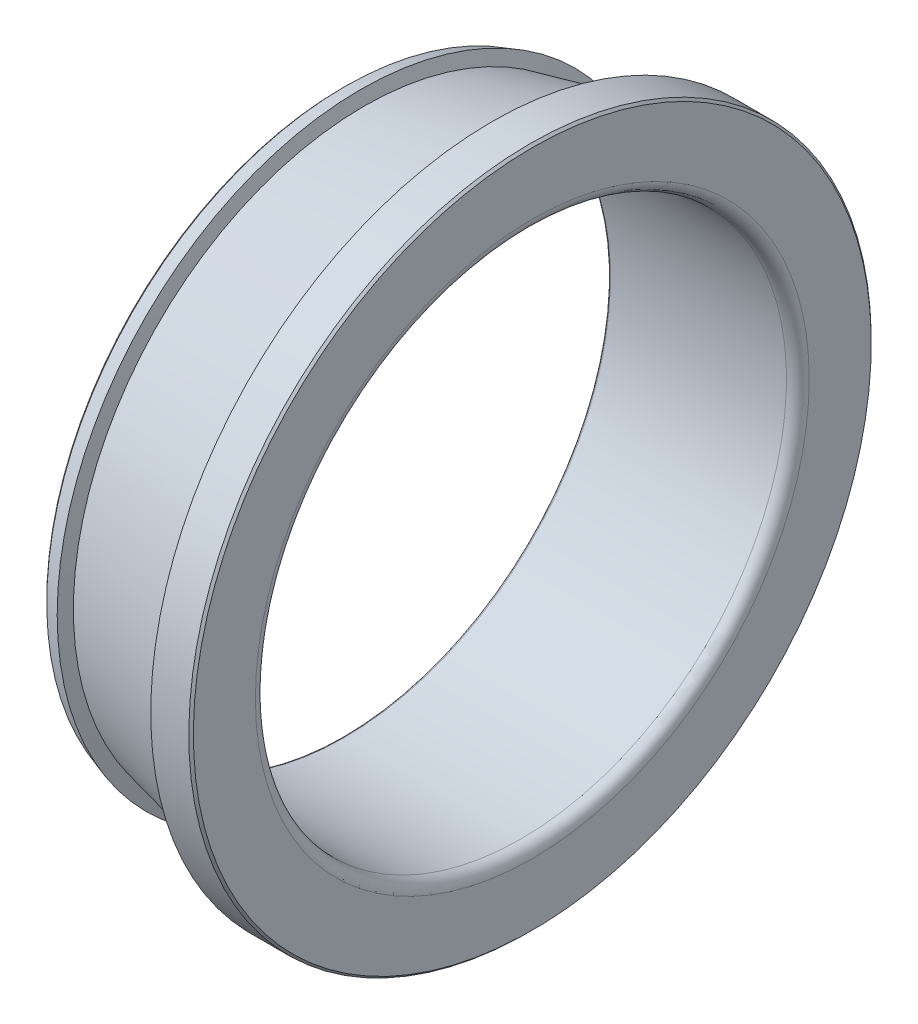
ISO-10303-21;
HEADER;
FILE_DESCRIPTION(('STEP AP214'),'2;1');
FILE_NAME('part.step','',(''),(''),'','','');
FILE_SCHEMA(('AUTOMOTIVE_DESIGN { 1 0 10303 214 1 1 1 1 }'));
ENDSEC;
DATA;
#1=APPLICATION_CONTEXT('core data for automotive mechanical design processes');
#2=APPLICATION_PROTOCOL_DEFINITION('international standard','automotive_design',2000,#1);
#3=PRODUCT_CONTEXT('',#1,'mechanical');
#4=PRODUCT('Part','Part','',(#3));
#5=PRODUCT_RELATED_PRODUCT_CATEGORY('part','',(#4));
#6=PRODUCT_DEFINITION_FORMATION('','',#4);
#7=PRODUCT_DEFINITION_CONTEXT('part definition',#1,'design');
#8=PRODUCT_DEFINITION('design','',#6,#7);
#9=PRODUCT_DEFINITION_SHAPE('','',#8);
#10=(LENGTH_UNIT() NAMED_UNIT(*) SI_UNIT(.MILLI.,.METRE.));
#11=(NAMED_UNIT(*) PLANE_ANGLE_UNIT() SI_UNIT($,.RADIAN.));
#12=(NAMED_UNIT(*) SI_UNIT($,.STERADIAN.) SOLID_ANGLE_UNIT());
#13=UNCERTAINTY_MEASURE_WITH_UNIT(LENGTH_MEASURE(1.E-05),#10,'distance_accuracy_value','');
#14=(GEOMETRIC_REPRESENTATION_CONTEXT(3) GLOBAL_UNCERTAINTY_ASSIGNED_CONTEXT((#13)) GLOBAL_UNIT_ASSIGNED_CONTEXT((#10,
#11,#12)) REPRESENTATION_CONTEXT('',''));
#15=CARTESIAN_POINT('',(0.,0.,0.));
#16=DIRECTION('',(0.,0.,1.));
#17=DIRECTION('',(1.,0.,0.));
#18=AXIS2_PLACEMENT_3D('',#15,#16,#17);
#19=CARTESIAN_POINT('',(8.7,0.,0.));
#20=DIRECTION('',(1.,0.,0.));
#21=DIRECTION('',(0.,1.,0.));
#22=AXIS2_PLACEMENT_3D('',#19,#20,#21);
#23=CONICAL_SURFACE('',#22,42.1375,0.32576301614448);
#24=CARTESIAN_POINT('',(0.3,0.,0.));
#25=DIRECTION('',(1.,0.,0.));
#26=DIRECTION('',(0.,1.,0.));
#27=AXIS2_PLACEMENT_3D('',#24,#25,#26);
#28=CIRCLE('',#27,39.3);
#29=CARTESIAN_POINT('',(0.3,39.3,0.));
#30=VERTEX_POINT('',#29);
#31=EDGE_CURVE('E11',#30,#30,#28,.T.);
#32=ORIENTED_EDGE('',*,*,#31,.T.);
#33=EDGE_LOOP('',(#32));
#34=FACE_BOUND('',#33,.T.);
#35=CARTESIAN_POINT('',(2.37613985401055,0.,0.));
#36=DIRECTION('',(-1.,0.,0.));
#37=DIRECTION('',(0.,1.,0.));
#38=AXIS2_PLACEMENT_3D('',#35,#36,#37);
#39=CIRCLE('',#38,40.0013150994947);
#40=CARTESIAN_POINT('',(2.37613985401055,-40.0013150994947,0.));
#41=VERTEX_POINT('',#40);
#42=EDGE_CURVE('E64',#41,#41,#39,.T.);
#43=ORIENTED_EDGE('',*,*,#42,.T.);
#44=EDGE_LOOP('',(#43));
#45=FACE_BOUND('',#44,.T.);
#46=ADVANCED_FACE('F16',(#34,#45),#23,.T.);
#47=CARTESIAN_POINT('',(0.15,0.,0.));
#48=DIRECTION('',(1.,0.,0.));
#49=DIRECTION('',(0.,1.,0.));
#50=AXIS2_PLACEMENT_3D('',#47,#48,#49);
#51=CONICAL_SURFACE('',#50,39.15,0.785398163397443);
#52=CARTESIAN_POINT('',(0.,0.,0.));
#53=DIRECTION('',(1.,0.,0.));
#54=DIRECTION('',(0.,1.,0.));
#55=AXIS2_PLACEMENT_3D('',#52,#53,#54);
#56=CIRCLE('',#55,39.);
#57=CARTESIAN_POINT('',(0.,39.,0.));
#58=VERTEX_POINT('',#57);
#59=EDGE_CURVE('E19',#58,#58,#56,.T.);
#60=ORIENTED_EDGE('',*,*,#59,.T.);
#61=EDGE_LOOP('',(#60));
#62=FACE_BOUND('',#61,.T.);
#63=ORIENTED_EDGE('',*,*,#31,.F.);
#64=EDGE_LOOP('',(#63));
#65=FACE_BOUND('',#64,.T.);
#66=ADVANCED_FACE('F107',(#62,#65),#51,.T.);
#67=CARTESIAN_POINT('',(0.,37.15,0.));
#68=DIRECTION('',(-1.,0.,0.));
#69=DIRECTION('',(0.,-1.,0.));
#70=AXIS2_PLACEMENT_3D('',#67,#68,#69);
#71=PLANE('',#70);
#72=CARTESIAN_POINT('',(0.,0.,0.));
#73=DIRECTION('',(1.,0.,0.));
#74=DIRECTION('',(0.,1.,0.));
#75=AXIS2_PLACEMENT_3D('',#72,#73,#74);
#76=CIRCLE('',#75,35.3);
#77=CARTESIAN_POINT('',(0.,35.3,0.));
#78=VERTEX_POINT('',#77);
#79=EDGE_CURVE('E48',#78,#78,#76,.T.);
#80=ORIENTED_EDGE('',*,*,#79,.T.);
#81=EDGE_LOOP('',(#80));
#82=FACE_BOUND('',#81,.T.);
#83=ORIENTED_EDGE('',*,*,#59,.F.);
#84=EDGE_LOOP('',(#83));
#85=FACE_BOUND('',#84,.T.);
#86=ADVANCED_FACE('F111',(#82,#85),#71,.T.);
#87=CARTESIAN_POINT('',(0.3,0.,0.));
#88=DIRECTION('',(1.,0.,0.));
#89=DIRECTION('',(0.,0.,-1.));
#90=AXIS2_PLACEMENT_3D('',#87,#88,#89);
#91=TOROIDAL_SURFACE('',#90,35.3,0.3);
#92=CARTESIAN_POINT('',(0.3,0.,0.));
#93=DIRECTION('',(1.,0.,0.));
#94=DIRECTION('',(0.,1.,0.));
#95=AXIS2_PLACEMENT_3D('',#92,#93,#94);
#96=CIRCLE('',#95,35.);
#97=CARTESIAN_POINT('',(0.3,35.,0.));
#98=VERTEX_POINT('',#97);
#99=EDGE_CURVE('E53',#98,#98,#96,.T.);
#100=ORIENTED_EDGE('',*,*,#99,.T.);
#101=EDGE_LOOP('',(#100));
#102=FACE_BOUND('',#101,.T.);
#103=ORIENTED_EDGE('',*,*,#79,.F.);
#104=EDGE_LOOP('',(#103));
#105=FACE_BOUND('',#104,.T.);
#106=ADVANCED_FACE('F116',(#102,#105),#91,.T.);
#107=CARTESIAN_POINT('',(11.9,0.,0.));
#108=DIRECTION('',(-1.,0.,0.));
#109=DIRECTION('',(0.,1.,0.));
#110=AXIS2_PLACEMENT_3D('',#107,#108,#109);
#111=CYLINDRICAL_SURFACE('',#110,35.);
#112=CARTESIAN_POINT('',(23.5,0.,0.));
#113=DIRECTION('',(1.,0.,0.));
#114=DIRECTION('',(0.,1.,0.));
#115=AXIS2_PLACEMENT_3D('',#112,#113,#114);
#116=CIRCLE('',#115,35.);
#117=CARTESIAN_POINT('',(23.5,35.,0.));
#118=VERTEX_POINT('',#117);
#119=EDGE_CURVE('E81',#118,#118,#116,.T.);
#120=ORIENTED_EDGE('',*,*,#119,.T.);
#121=EDGE_LOOP('',(#120));
#122=FACE_BOUND('',#121,.T.);
#123=ORIENTED_EDGE('',*,*,#99,.F.);
#124=EDGE_LOOP('',(#123));
#125=FACE_BOUND('',#124,.T.);
#126=ADVANCED_FACE('F122',(#122,#125),#111,.F.);
#127=CARTESIAN_POINT('',(23.5,0.,0.));
#128=DIRECTION('',(1.,0.,0.));
#129=DIRECTION('',(0.,0.,-1.));
#130=AXIS2_PLACEMENT_3D('',#127,#128,#129);
#131=TOROIDAL_SURFACE('',#130,36.5,1.5);
#132=CARTESIAN_POINT('',(25.,0.,0.));
#133=DIRECTION('',(1.,0.,0.));
#134=DIRECTION('',(0.,1.,0.));
#135=AXIS2_PLACEMENT_3D('',#132,#133,#134);
#136=CIRCLE('',#135,36.5);
#137=CARTESIAN_POINT('',(25.,36.5,0.));
#138=VERTEX_POINT('',#137);
#139=EDGE_CURVE('E79',#138,#138,#136,.T.);
#140=ORIENTED_EDGE('',*,*,#139,.T.);
#141=EDGE_LOOP('',(#140));
#142=FACE_BOUND('',#141,.T.);
#143=ORIENTED_EDGE('',*,*,#119,.F.);
#144=EDGE_LOOP('',(#143));
#145=FACE_BOUND('',#144,.T.);
#146=ADVANCED_FACE('F125',(#142,#145),#131,.T.);
#147=CARTESIAN_POINT('',(25.,40.5875,0.));
#148=DIRECTION('',(1.,0.,0.));
#149=DIRECTION('',(0.,1.,0.));
#150=AXIS2_PLACEMENT_3D('',#147,#148,#149);
#151=PLANE('',#150);
#152=CARTESIAN_POINT('',(25.,0.,0.));
#153=DIRECTION('',(1.,0.,0.));
#154=DIRECTION('',(0.,1.,0.));
#155=AXIS2_PLACEMENT_3D('',#152,#153,#154);
#156=CIRCLE('',#155,44.675);
#157=CARTESIAN_POINT('',(25.,44.675,0.));
#158=VERTEX_POINT('',#157);
#159=EDGE_CURVE('E73',#158,#158,#156,.T.);
#160=ORIENTED_EDGE('',*,*,#159,.T.);
#161=EDGE_LOOP('',(#160));
#162=FACE_BOUND('',#161,.T.);
#163=ORIENTED_EDGE('',*,*,#139,.F.);
#164=EDGE_LOOP('',(#163));
#165=FACE_BOUND('',#164,.T.);
#166=ADVANCED_FACE('F129',(#162,#165),#151,.T.);
#167=CARTESIAN_POINT('',(24.85,0.,0.));
#168=DIRECTION('',(-1.,0.,0.));
#169=DIRECTION('',(0.,1.,0.));
#170=AXIS2_PLACEMENT_3D('',#167,#168,#169);
#171=CONICAL_SURFACE('',#170,44.825,0.785398163397442);
#172=CARTESIAN_POINT('',(24.7,0.,0.));
#173=DIRECTION('',(1.,0.,0.));
#174=DIRECTION('',(0.,1.,0.));
#175=AXIS2_PLACEMENT_3D('',#172,#173,#174);
#176=CIRCLE('',#175,44.975);
#177=CARTESIAN_POINT('',(24.7,44.975,0.));
#178=VERTEX_POINT('',#177);
#179=EDGE_CURVE('E71',#178,#178,#176,.T.);
#180=ORIENTED_EDGE('',*,*,#179,.T.);
#181=EDGE_LOOP('',(#180));
#182=FACE_BOUND('',#181,.T.);
#183=ORIENTED_EDGE('',*,*,#159,.F.);
#184=EDGE_LOOP('',(#183));
#185=FACE_BOUND('',#184,.T.);
#186=ADVANCED_FACE('F133',(#182,#185),#171,.T.);
#187=CARTESIAN_POINT('',(20.9,0.,0.));
#188=DIRECTION('',(-1.,0.,0.));
#189=DIRECTION('',(0.,1.,0.));
#190=AXIS2_PLACEMENT_3D('',#187,#188,#189);
#191=CYLINDRICAL_SURFACE('',#190,44.975);
#192=ORIENTED_EDGE('',*,*,#179,.F.);
#193=EDGE_LOOP('',(#192));
#194=FACE_BOUND('',#193,.T.);
#195=CARTESIAN_POINT('',(19.6816329111307,0.,0.));
#196=DIRECTION('',(1.,0.,0.));
#197=DIRECTION('',(0.,1.,0.));
#198=AXIS2_PLACEMENT_3D('',#195,#196,#197);
#199=CIRCLE('',#198,44.975);
#200=CARTESIAN_POINT('',(19.6816329111307,-44.975,0.));
#201=VERTEX_POINT('',#200);
#202=EDGE_CURVE('E68',#201,#201,#199,.T.);
#203=ORIENTED_EDGE('',*,*,#202,.T.);
#204=EDGE_LOOP('',(#203));
#205=FACE_BOUND('',#204,.T.);
#206=ADVANCED_FACE('F69',(#194,#205),#191,.T.);
#207=CARTESIAN_POINT('',(19.1099465065881,0.,0.));
#208=DIRECTION('',(-1.,0.,0.));
#209=DIRECTION('',(0.,1.,0.));
#210=AXIS2_PLACEMENT_3D('',#207,#208,#209);
#211=CONICAL_SURFACE('',#210,47.1775686038106,1.31684568464197);
#212=CARTESIAN_POINT('',(20.3660957309273,0.,0.));
#213=DIRECTION('',(1.,0.,0.));
#214=DIRECTION('',(0.,1.,0.));
#215=AXIS2_PLACEMENT_3D('',#212,#213,#214);
#216=CIRCLE('',#215,42.3379313109764);
#217=CARTESIAN_POINT('',(20.3660957309273,42.3379313109764,0.));
#218=VERTEX_POINT('',#217);
#219=EDGE_CURVE('E75',#218,#218,#216,.T.);
#220=ORIENTED_EDGE('',*,*,#219,.T.);
#221=EDGE_LOOP('',(#220));
#222=FACE_BOUND('',#221,.T.);
#223=ORIENTED_EDGE('',*,*,#202,.F.);
#224=EDGE_LOOP('',(#223));
#225=FACE_BOUND('',#224,.T.);
#226=ADVANCED_FACE('F96',(#222,#225),#211,.F.);
#227=CARTESIAN_POINT('',(1.68725225238479,0.,0.));
#228=DIRECTION('',(-1.,0.,0.));
#229=DIRECTION('',(0.,1.,0.));
#230=AXIS2_PLACEMENT_3D('',#227,#228,#229);
#231=CONICAL_SURFACE('',#230,42.6554313961894,1.31684568464197);
#232=CARTESIAN_POINT('',(2.81576764070924,0.,0.));
#233=DIRECTION('',(1.,0.,0.));
#234=DIRECTION('',(0.,1.,0.));
#235=AXIS2_PLACEMENT_3D('',#232,#233,#234);
#236=CIRCLE('',#235,38.3075362153876);
#237=CARTESIAN_POINT('',(2.81576764070924,38.3075362153876,0.));
#238=VERTEX_POINT('',#237);
#239=EDGE_CURVE('E84',#238,#238,#236,.T.);
#240=ORIENTED_EDGE('',*,*,#239,.F.);
#241=EDGE_LOOP('',(#240));
#242=FACE_BOUND('',#241,.T.);
#243=ORIENTED_EDGE('',*,*,#42,.F.);
#244=EDGE_LOOP('',(#243));
#245=FACE_BOUND('',#244,.T.);
#246=ADVANCED_FACE('F93',(#242,#245),#231,.T.);
#247=CARTESIAN_POINT('',(11.5909316858183,0.,0.));
#248=DIRECTION('',(1.,0.,0.));
#249=DIRECTION('',(0.,1.,0.));
#250=AXIS2_PLACEMENT_3D('',#247,#248,#249);
#251=CONICAL_SURFACE('',#250,40.322733763182,0.225733904135939);
#252=ORIENTED_EDGE('',*,*,#219,.F.);
#253=EDGE_LOOP('',(#252));
#254=FACE_BOUND('',#253,.T.);
#255=ORIENTED_EDGE('',*,*,#239,.T.);
#256=EDGE_LOOP('',(#255));
#257=FACE_BOUND('',#256,.T.);
#258=ADVANCED_FACE('F91',(#254,#257),#251,.T.);
#259=CLOSED_SHELL('',(#46,#66,#86,#106,#126,#146,#166,#186,#206,#226,#246,#258));
#260=MANIFOLD_SOLID_BREP('B1',#259);
#261=ADVANCED_BREP_SHAPE_REPRESENTATION('',(#18,#260),#14);
#262=SHAPE_DEFINITION_REPRESENTATION(#9,#261);
ENDSEC;
END-ISO-10303-21;
